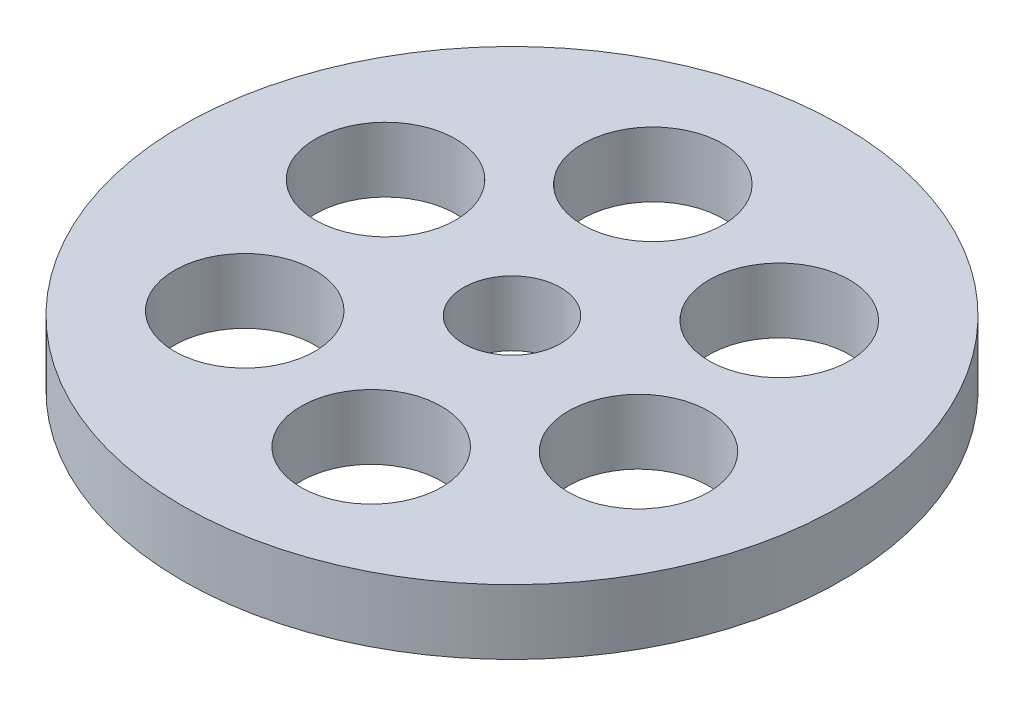
ISO-10303-21;
HEADER;
FILE_DESCRIPTION(('STEP AP214'),'2;1');
FILE_NAME('part.step','',(''),(''),'','','');
FILE_SCHEMA(('AUTOMOTIVE_DESIGN { 1 0 10303 214 1 1 1 1 }'));
ENDSEC;
DATA;
#1=APPLICATION_CONTEXT('core data for automotive mechanical design processes');
#2=APPLICATION_PROTOCOL_DEFINITION('international standard','automotive_design',2000,#1);
#3=PRODUCT_CONTEXT('',#1,'mechanical');
#4=PRODUCT('Part','Part','',(#3));
#5=PRODUCT_RELATED_PRODUCT_CATEGORY('part','',(#4));
#6=PRODUCT_DEFINITION_FORMATION('','',#4);
#7=PRODUCT_DEFINITION_CONTEXT('part definition',#1,'design');
#8=PRODUCT_DEFINITION('design','',#6,#7);
#9=PRODUCT_DEFINITION_SHAPE('','',#8);
#10=(LENGTH_UNIT() NAMED_UNIT(*) SI_UNIT(.MILLI.,.METRE.));
#11=(NAMED_UNIT(*) PLANE_ANGLE_UNIT() SI_UNIT($,.RADIAN.));
#12=(NAMED_UNIT(*) SI_UNIT($,.STERADIAN.) SOLID_ANGLE_UNIT());
#13=UNCERTAINTY_MEASURE_WITH_UNIT(LENGTH_MEASURE(1.E-05),#10,'distance_accuracy_value','');
#14=(GEOMETRIC_REPRESENTATION_CONTEXT(3) GLOBAL_UNCERTAINTY_ASSIGNED_CONTEXT((#13)) GLOBAL_UNIT_ASSIGNED_CONTEXT((#10,
#11,#12)) REPRESENTATION_CONTEXT('',''));
#15=CARTESIAN_POINT('',(0.,0.,0.));
#16=DIRECTION('',(0.,0.,1.));
#17=DIRECTION('',(1.,0.,0.));
#18=AXIS2_PLACEMENT_3D('',#15,#16,#17);
#19=CARTESIAN_POINT('',(0.,6.,0.));
#20=DIRECTION('',(0.,-1.,0.));
#21=DIRECTION('',(0.,0.,-1.));
#22=AXIS2_PLACEMENT_3D('',#19,#20,#21);
#23=CYLINDRICAL_SURFACE('',#22,30.5);
#24=CARTESIAN_POINT('',(0.,6.,0.));
#25=DIRECTION('',(0.,1.,0.));
#26=DIRECTION('',(0.,0.,1.));
#27=AXIS2_PLACEMENT_3D('',#24,#25,#26);
#28=CIRCLE('',#27,30.5);
#29=CARTESIAN_POINT('',(0.,6.,30.5));
#30=VERTEX_POINT('',#29);
#31=EDGE_CURVE('E10',#30,#30,#28,.T.);
#32=ORIENTED_EDGE('',*,*,#31,.F.);
#33=EDGE_LOOP('',(#32));
#34=FACE_BOUND('',#33,.T.);
#35=CARTESIAN_POINT('',(0.,0.,0.));
#36=DIRECTION('',(0.,1.,0.));
#37=DIRECTION('',(0.,0.,1.));
#38=AXIS2_PLACEMENT_3D('',#35,#36,#37);
#39=CIRCLE('',#38,30.5);
#40=CARTESIAN_POINT('',(0.,0.,30.5));
#41=VERTEX_POINT('',#40);
#42=EDGE_CURVE('E33',#41,#41,#39,.T.);
#43=ORIENTED_EDGE('',*,*,#42,.T.);
#44=EDGE_LOOP('',(#43));
#45=FACE_BOUND('',#44,.T.);
#46=ADVANCED_FACE('F30',(#34,#45),#23,.T.);
#47=CARTESIAN_POINT('',(0.,6.,0.));
#48=DIRECTION('',(0.,1.,0.));
#49=DIRECTION('',(0.,0.,1.));
#50=AXIS2_PLACEMENT_3D('',#47,#48,#49);
#51=PLANE('',#50);
#52=CARTESIAN_POINT('',(-4.0042726407257,6.,-17.0357213119591));
#53=DIRECTION('',(0.,1.,0.));
#54=DIRECTION('',(0.,0.,1.));
#55=AXIS2_PLACEMENT_3D('',#52,#53,#54);
#56=CIRCLE('',#55,6.5);
#57=CARTESIAN_POINT('',(-4.0042726407257,6.,-10.535721311959));
#58=VERTEX_POINT('',#57);
#59=EDGE_CURVE('E67',#58,#58,#56,.T.);
#60=ORIENTED_EDGE('',*,*,#59,.F.);
#61=EDGE_LOOP('',(#60));
#62=FACE_BOUND('',#61,.T.);
#63=CARTESIAN_POINT('',(-16.7555037483114,6.,-5.05005882543203));
#64=DIRECTION('',(0.,1.,0.));
#65=DIRECTION('',(0.,0.,1.));
#66=AXIS2_PLACEMENT_3D('',#63,#64,#65);
#67=CIRCLE('',#66,6.5);
#68=CARTESIAN_POINT('',(-16.7555037483114,6.,1.44994117456797));
#69=VERTEX_POINT('',#68);
#70=EDGE_CURVE('E68',#69,#69,#67,.T.);
#71=ORIENTED_EDGE('',*,*,#70,.F.);
#72=EDGE_LOOP('',(#71));
#73=FACE_BOUND('',#72,.T.);
#74=CARTESIAN_POINT('',(12.7512311075857,6.,-11.985662486527));
#75=DIRECTION('',(0.,1.,0.));
#76=DIRECTION('',(0.,0.,1.));
#77=AXIS2_PLACEMENT_3D('',#74,#75,#76);
#78=CIRCLE('',#77,6.5);
#79=CARTESIAN_POINT('',(12.7512311075857,6.,-5.48566248652695));
#80=VERTEX_POINT('',#79);
#81=EDGE_CURVE('E61',#80,#80,#78,.T.);
#82=ORIENTED_EDGE('',*,*,#81,.F.);
#83=EDGE_LOOP('',(#82));
#84=FACE_BOUND('',#83,.T.);
#85=CARTESIAN_POINT('',(16.7555037483113,6.,5.05005882543214));
#86=DIRECTION('',(0.,1.,0.));
#87=DIRECTION('',(0.,0.,1.));
#88=AXIS2_PLACEMENT_3D('',#85,#86,#87);
#89=CIRCLE('',#88,6.5);
#90=CARTESIAN_POINT('',(16.7555037483113,6.,11.5500588254321));
#91=VERTEX_POINT('',#90);
#92=EDGE_CURVE('E54',#91,#91,#89,.T.);
#93=ORIENTED_EDGE('',*,*,#92,.F.);
#94=EDGE_LOOP('',(#93));
#95=FACE_BOUND('',#94,.T.);
#96=CARTESIAN_POINT('',(4.00427264072558,6.,17.0357213119591));
#97=DIRECTION('',(0.,1.,0.));
#98=DIRECTION('',(0.,0.,1.));
#99=AXIS2_PLACEMENT_3D('',#96,#97,#98);
#100=CIRCLE('',#99,6.5);
#101=CARTESIAN_POINT('',(4.00427264072558,6.,23.5357213119591));
#102=VERTEX_POINT('',#101);
#103=EDGE_CURVE('E78',#102,#102,#100,.T.);
#104=ORIENTED_EDGE('',*,*,#103,.F.);
#105=EDGE_LOOP('',(#104));
#106=FACE_BOUND('',#105,.T.);
#107=CARTESIAN_POINT('',(-12.7512311075856,6.,11.985662486527));
#108=DIRECTION('',(0.,1.,0.));
#109=DIRECTION('',(0.,0.,1.));
#110=AXIS2_PLACEMENT_3D('',#107,#108,#109);
#111=CIRCLE('',#110,6.5);
#112=CARTESIAN_POINT('',(-12.7512311075856,6.,18.485662486527));
#113=VERTEX_POINT('',#112);
#114=EDGE_CURVE('E48',#113,#113,#111,.T.);
#115=ORIENTED_EDGE('',*,*,#114,.F.);
#116=EDGE_LOOP('',(#115));
#117=FACE_BOUND('',#116,.T.);
#118=CARTESIAN_POINT('',(0.,6.,0.));
#119=DIRECTION('',(0.,1.,0.));
#120=DIRECTION('',(0.,0.,1.));
#121=AXIS2_PLACEMENT_3D('',#118,#119,#120);
#122=CIRCLE('',#121,4.5);
#123=CARTESIAN_POINT('',(0.,6.,4.5));
#124=VERTEX_POINT('',#123);
#125=EDGE_CURVE('E44',#124,#124,#122,.T.);
#126=ORIENTED_EDGE('',*,*,#125,.F.);
#127=EDGE_LOOP('',(#126));
#128=FACE_BOUND('',#127,.T.);
#129=ORIENTED_EDGE('',*,*,#31,.T.);
#130=EDGE_LOOP('',(#129));
#131=FACE_BOUND('',#130,.T.);
#132=ADVANCED_FACE('F95',(#62,#73,#84,#95,#106,#117,#128,#131),#51,.T.);
#133=CARTESIAN_POINT('',(0.,0.,0.));
#134=DIRECTION('',(0.,1.,0.));
#135=DIRECTION('',(0.,0.,1.));
#136=AXIS2_PLACEMENT_3D('',#133,#134,#135);
#137=PLANE('',#136);
#138=CARTESIAN_POINT('',(-4.0042726407257,0.,-17.0357213119591));
#139=DIRECTION('',(0.,1.,0.));
#140=DIRECTION('',(0.,0.,1.));
#141=AXIS2_PLACEMENT_3D('',#138,#139,#140);
#142=CIRCLE('',#141,6.5);
#143=CARTESIAN_POINT('',(-4.0042726407257,0.,-10.535721311959));
#144=VERTEX_POINT('',#143);
#145=EDGE_CURVE('E71',#144,#144,#142,.T.);
#146=ORIENTED_EDGE('',*,*,#145,.T.);
#147=EDGE_LOOP('',(#146));
#148=FACE_BOUND('',#147,.T.);
#149=CARTESIAN_POINT('',(-16.7555037483114,0.,-5.05005882543203));
#150=DIRECTION('',(0.,1.,0.));
#151=DIRECTION('',(0.,0.,1.));
#152=AXIS2_PLACEMENT_3D('',#149,#150,#151);
#153=CIRCLE('',#152,6.5);
#154=CARTESIAN_POINT('',(-16.7555037483114,0.,1.44994117456797));
#155=VERTEX_POINT('',#154);
#156=EDGE_CURVE('E51',#155,#155,#153,.T.);
#157=ORIENTED_EDGE('',*,*,#156,.T.);
#158=EDGE_LOOP('',(#157));
#159=FACE_BOUND('',#158,.T.);
#160=CARTESIAN_POINT('',(12.7512311075857,0.,-11.985662486527));
#161=DIRECTION('',(0.,1.,0.));
#162=DIRECTION('',(0.,0.,1.));
#163=AXIS2_PLACEMENT_3D('',#160,#161,#162);
#164=CIRCLE('',#163,6.5);
#165=CARTESIAN_POINT('',(12.7512311075857,0.,-5.48566248652695));
#166=VERTEX_POINT('',#165);
#167=EDGE_CURVE('E64',#166,#166,#164,.T.);
#168=ORIENTED_EDGE('',*,*,#167,.T.);
#169=EDGE_LOOP('',(#168));
#170=FACE_BOUND('',#169,.T.);
#171=CARTESIAN_POINT('',(16.7555037483113,0.,5.05005882543214));
#172=DIRECTION('',(0.,1.,0.));
#173=DIRECTION('',(0.,0.,1.));
#174=AXIS2_PLACEMENT_3D('',#171,#172,#173);
#175=CIRCLE('',#174,6.5);
#176=CARTESIAN_POINT('',(16.7555037483113,0.,11.5500588254321));
#177=VERTEX_POINT('',#176);
#178=EDGE_CURVE('E57',#177,#177,#175,.T.);
#179=ORIENTED_EDGE('',*,*,#178,.T.);
#180=EDGE_LOOP('',(#179));
#181=FACE_BOUND('',#180,.T.);
#182=CARTESIAN_POINT('',(4.00427264072558,0.,17.0357213119591));
#183=DIRECTION('',(0.,1.,0.));
#184=DIRECTION('',(0.,0.,1.));
#185=AXIS2_PLACEMENT_3D('',#182,#183,#184);
#186=CIRCLE('',#185,6.5);
#187=CARTESIAN_POINT('',(4.00427264072558,0.,23.5357213119591));
#188=VERTEX_POINT('',#187);
#189=EDGE_CURVE('E58',#188,#188,#186,.T.);
#190=ORIENTED_EDGE('',*,*,#189,.T.);
#191=EDGE_LOOP('',(#190));
#192=FACE_BOUND('',#191,.T.);
#193=CARTESIAN_POINT('',(-12.7512311075856,0.,11.985662486527));
#194=DIRECTION('',(0.,1.,0.));
#195=DIRECTION('',(0.,0.,1.));
#196=AXIS2_PLACEMENT_3D('',#193,#194,#195);
#197=CIRCLE('',#196,6.5);
#198=CARTESIAN_POINT('',(-12.7512311075856,0.,18.485662486527));
#199=VERTEX_POINT('',#198);
#200=EDGE_CURVE('E47',#199,#199,#197,.T.);
#201=ORIENTED_EDGE('',*,*,#200,.T.);
#202=EDGE_LOOP('',(#201));
#203=FACE_BOUND('',#202,.T.);
#204=CARTESIAN_POINT('',(0.,0.,0.));
#205=DIRECTION('',(0.,1.,0.));
#206=DIRECTION('',(0.,0.,1.));
#207=AXIS2_PLACEMENT_3D('',#204,#205,#206);
#208=CIRCLE('',#207,4.5);
#209=CARTESIAN_POINT('',(0.,0.,4.5));
#210=VERTEX_POINT('',#209);
#211=EDGE_CURVE('E40',#210,#210,#208,.T.);
#212=ORIENTED_EDGE('',*,*,#211,.T.);
#213=EDGE_LOOP('',(#212));
#214=FACE_BOUND('',#213,.T.);
#215=ORIENTED_EDGE('',*,*,#42,.F.);
#216=EDGE_LOOP('',(#215));
#217=FACE_BOUND('',#216,.T.);
#218=ADVANCED_FACE('F84',(#148,#159,#170,#181,#192,#203,#214,#217),#137,.F.);
#219=CARTESIAN_POINT('',(0.,6.,0.));
#220=DIRECTION('',(0.,1.,0.));
#221=DIRECTION('',(0.,0.,1.));
#222=AXIS2_PLACEMENT_3D('',#219,#220,#221);
#223=CYLINDRICAL_SURFACE('',#222,4.5);
#224=ORIENTED_EDGE('',*,*,#211,.F.);
#225=EDGE_LOOP('',(#224));
#226=FACE_BOUND('',#225,.T.);
#227=ORIENTED_EDGE('',*,*,#125,.T.);
#228=EDGE_LOOP('',(#227));
#229=FACE_BOUND('',#228,.T.);
#230=ADVANCED_FACE('F104',(#226,#229),#223,.F.);
#231=CARTESIAN_POINT('',(-12.7512311075856,0.,11.985662486527));
#232=DIRECTION('',(0.,1.,0.));
#233=DIRECTION('',(0.,0.,1.));
#234=AXIS2_PLACEMENT_3D('',#231,#232,#233);
#235=CYLINDRICAL_SURFACE('',#234,6.5);
#236=ORIENTED_EDGE('',*,*,#200,.F.);
#237=EDGE_LOOP('',(#236));
#238=FACE_BOUND('',#237,.T.);
#239=ORIENTED_EDGE('',*,*,#114,.T.);
#240=EDGE_LOOP('',(#239));
#241=FACE_BOUND('',#240,.T.);
#242=ADVANCED_FACE('F91',(#238,#241),#235,.F.);
#243=CARTESIAN_POINT('',(4.00427264072558,0.,17.0357213119591));
#244=DIRECTION('',(0.,1.,0.));
#245=DIRECTION('',(0.,0.,1.));
#246=AXIS2_PLACEMENT_3D('',#243,#244,#245);
#247=CYLINDRICAL_SURFACE('',#246,6.5);
#248=ORIENTED_EDGE('',*,*,#189,.F.);
#249=EDGE_LOOP('',(#248));
#250=FACE_BOUND('',#249,.T.);
#251=ORIENTED_EDGE('',*,*,#103,.T.);
#252=EDGE_LOOP('',(#251));
#253=FACE_BOUND('',#252,.T.);
#254=ADVANCED_FACE('F87',(#250,#253),#247,.F.);
#255=CARTESIAN_POINT('',(16.7555037483113,0.,5.05005882543214));
#256=DIRECTION('',(0.,1.,0.));
#257=DIRECTION('',(0.,0.,1.));
#258=AXIS2_PLACEMENT_3D('',#255,#256,#257);
#259=CYLINDRICAL_SURFACE('',#258,6.5);
#260=ORIENTED_EDGE('',*,*,#178,.F.);
#261=EDGE_LOOP('',(#260));
#262=FACE_BOUND('',#261,.T.);
#263=ORIENTED_EDGE('',*,*,#92,.T.);
#264=EDGE_LOOP('',(#263));
#265=FACE_BOUND('',#264,.T.);
#266=ADVANCED_FACE('F90',(#262,#265),#259,.F.);
#267=CARTESIAN_POINT('',(12.7512311075857,0.,-11.985662486527));
#268=DIRECTION('',(0.,1.,0.));
#269=DIRECTION('',(0.,0.,1.));
#270=AXIS2_PLACEMENT_3D('',#267,#268,#269);
#271=CYLINDRICAL_SURFACE('',#270,6.5);
#272=ORIENTED_EDGE('',*,*,#167,.F.);
#273=EDGE_LOOP('',(#272));
#274=FACE_BOUND('',#273,.T.);
#275=ORIENTED_EDGE('',*,*,#81,.T.);
#276=EDGE_LOOP('',(#275));
#277=FACE_BOUND('',#276,.T.);
#278=ADVANCED_FACE('F153',(#274,#277),#271,.F.);
#279=CARTESIAN_POINT('',(-16.7555037483114,0.,-5.05005882543203));
#280=DIRECTION('',(0.,1.,0.));
#281=DIRECTION('',(0.,0.,1.));
#282=AXIS2_PLACEMENT_3D('',#279,#280,#281);
#283=CYLINDRICAL_SURFACE('',#282,6.5);
#284=ORIENTED_EDGE('',*,*,#156,.F.);
#285=EDGE_LOOP('',(#284));
#286=FACE_BOUND('',#285,.T.);
#287=ORIENTED_EDGE('',*,*,#70,.T.);
#288=EDGE_LOOP('',(#287));
#289=FACE_BOUND('',#288,.T.);
#290=ADVANCED_FACE('F163',(#286,#289),#283,.F.);
#291=CARTESIAN_POINT('',(-4.0042726407257,0.,-17.0357213119591));
#292=DIRECTION('',(0.,1.,0.));
#293=DIRECTION('',(0.,0.,1.));
#294=AXIS2_PLACEMENT_3D('',#291,#292,#293);
#295=CYLINDRICAL_SURFACE('',#294,6.5);
#296=ORIENTED_EDGE('',*,*,#145,.F.);
#297=EDGE_LOOP('',(#296));
#298=FACE_BOUND('',#297,.T.);
#299=ORIENTED_EDGE('',*,*,#59,.T.);
#300=EDGE_LOOP('',(#299));
#301=FACE_BOUND('',#300,.T.);
#302=ADVANCED_FACE('F173',(#298,#301),#295,.F.);
#303=CLOSED_SHELL('',(#46,#132,#218,#230,#242,#254,#266,#278,#290,#302));
#304=MANIFOLD_SOLID_BREP('B2',#303);
#305=ADVANCED_BREP_SHAPE_REPRESENTATION('',(#18,#304),#14);
#306=SHAPE_DEFINITION_REPRESENTATION(#9,#305);
ENDSEC;
END-ISO-10303-21;
